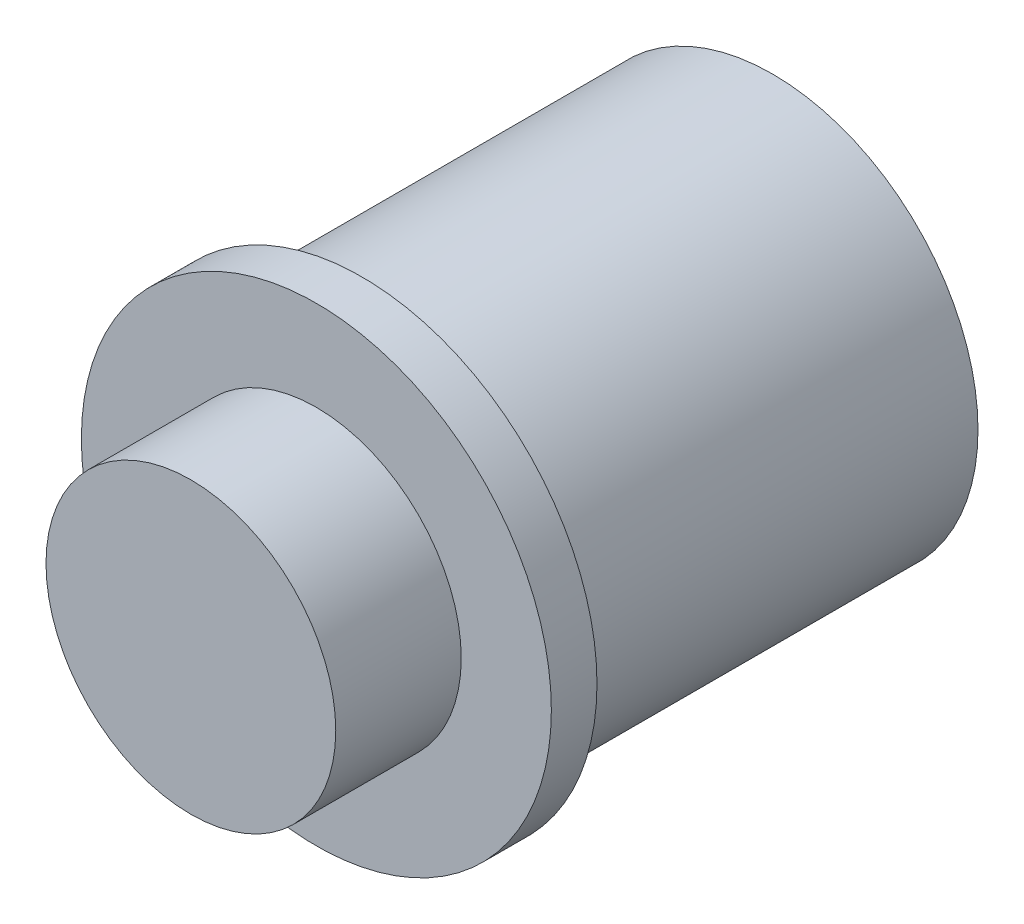
ISO-10303-21;
HEADER;
FILE_DESCRIPTION(('STEP AP214'),'2;1');
FILE_NAME('part.step','',(''),(''),'','','');
FILE_SCHEMA(('AUTOMOTIVE_DESIGN { 1 0 10303 214 1 1 1 1 }'));
ENDSEC;
DATA;
#1=APPLICATION_CONTEXT('core data for automotive mechanical design processes');
#2=APPLICATION_PROTOCOL_DEFINITION('international standard','automotive_design',2000,#1);
#3=PRODUCT_CONTEXT('',#1,'mechanical');
#4=PRODUCT('Part','Part','',(#3));
#5=PRODUCT_RELATED_PRODUCT_CATEGORY('part','',(#4));
#6=PRODUCT_DEFINITION_FORMATION('','',#4);
#7=PRODUCT_DEFINITION_CONTEXT('part definition',#1,'design');
#8=PRODUCT_DEFINITION('design','',#6,#7);
#9=PRODUCT_DEFINITION_SHAPE('','',#8);
#10=(LENGTH_UNIT() NAMED_UNIT(*) SI_UNIT(.MILLI.,.METRE.));
#11=(NAMED_UNIT(*) PLANE_ANGLE_UNIT() SI_UNIT($,.RADIAN.));
#12=(NAMED_UNIT(*) SI_UNIT($,.STERADIAN.) SOLID_ANGLE_UNIT());
#13=UNCERTAINTY_MEASURE_WITH_UNIT(LENGTH_MEASURE(1.E-05),#10,'distance_accuracy_value','');
#14=(GEOMETRIC_REPRESENTATION_CONTEXT(3) GLOBAL_UNCERTAINTY_ASSIGNED_CONTEXT((#13)) GLOBAL_UNIT_ASSIGNED_CONTEXT((#10,
#11,#12)) REPRESENTATION_CONTEXT('',''));
#15=CARTESIAN_POINT('',(0.,0.,0.));
#16=DIRECTION('',(0.,0.,1.));
#17=DIRECTION('',(1.,0.,0.));
#18=AXIS2_PLACEMENT_3D('',#15,#16,#17);
#19=CARTESIAN_POINT('',(0.,0.,18.));
#20=DIRECTION('',(0.,0.,-1.));
#21=DIRECTION('',(-1.,0.,0.));
#22=AXIS2_PLACEMENT_3D('',#19,#20,#21);
#23=CYLINDRICAL_SURFACE('',#22,9.);
#24=CARTESIAN_POINT('',(0.,0.,18.));
#25=DIRECTION('',(0.,0.,1.));
#26=DIRECTION('',(1.,0.,0.));
#27=AXIS2_PLACEMENT_3D('',#24,#25,#26);
#28=CIRCLE('',#27,9.);
#29=CARTESIAN_POINT('',(9.,0.,18.));
#30=VERTEX_POINT('',#29);
#31=EDGE_CURVE('E45',#30,#30,#28,.T.);
#32=ORIENTED_EDGE('',*,*,#31,.F.);
#33=EDGE_LOOP('',(#32));
#34=FACE_BOUND('',#33,.T.);
#35=CARTESIAN_POINT('',(0.,0.,0.));
#36=DIRECTION('',(0.,0.,1.));
#37=DIRECTION('',(1.,0.,0.));
#38=AXIS2_PLACEMENT_3D('',#35,#36,#37);
#39=CIRCLE('',#38,9.);
#40=CARTESIAN_POINT('',(9.,0.,0.));
#41=VERTEX_POINT('',#40);
#42=EDGE_CURVE('E40',#41,#41,#39,.T.);
#43=ORIENTED_EDGE('',*,*,#42,.T.);
#44=EDGE_LOOP('',(#43));
#45=FACE_BOUND('',#44,.T.);
#46=ADVANCED_FACE('F37',(#34,#45),#23,.T.);
#47=CARTESIAN_POINT('',(0.,0.,0.));
#48=DIRECTION('',(0.,0.,1.));
#49=DIRECTION('',(1.,0.,0.));
#50=AXIS2_PLACEMENT_3D('',#47,#48,#49);
#51=PLANE('',#50);
#52=ORIENTED_EDGE('',*,*,#42,.F.);
#53=EDGE_LOOP('',(#52));
#54=FACE_BOUND('',#53,.T.);
#55=ADVANCED_FACE('F83',(#54),#51,.F.);
#56=CARTESIAN_POINT('',(0.,0.,20.));
#57=DIRECTION('',(0.,0.,-1.));
#58=DIRECTION('',(-1.,0.,0.));
#59=AXIS2_PLACEMENT_3D('',#56,#57,#58);
#60=CYLINDRICAL_SURFACE('',#59,10.3);
#61=CARTESIAN_POINT('',(0.,0.,20.));
#62=DIRECTION('',(0.,0.,1.));
#63=DIRECTION('',(1.,0.,0.));
#64=AXIS2_PLACEMENT_3D('',#61,#62,#63);
#65=CIRCLE('',#64,10.3);
#66=CARTESIAN_POINT('',(10.3,0.,20.));
#67=VERTEX_POINT('',#66);
#68=EDGE_CURVE('E54',#67,#67,#65,.T.);
#69=ORIENTED_EDGE('',*,*,#68,.F.);
#70=EDGE_LOOP('',(#69));
#71=FACE_BOUND('',#70,.T.);
#72=CARTESIAN_POINT('',(0.,0.,18.));
#73=DIRECTION('',(0.,0.,1.));
#74=DIRECTION('',(1.,0.,0.));
#75=AXIS2_PLACEMENT_3D('',#72,#73,#74);
#76=CIRCLE('',#75,10.3);
#77=CARTESIAN_POINT('',(10.3,0.,18.));
#78=VERTEX_POINT('',#77);
#79=EDGE_CURVE('E58',#78,#78,#76,.T.);
#80=ORIENTED_EDGE('',*,*,#79,.T.);
#81=EDGE_LOOP('',(#80));
#82=FACE_BOUND('',#81,.T.);
#83=ADVANCED_FACE('F88',(#71,#82),#60,.T.);
#84=CARTESIAN_POINT('',(0.,0.,20.));
#85=DIRECTION('',(0.,0.,1.));
#86=DIRECTION('',(1.,0.,0.));
#87=AXIS2_PLACEMENT_3D('',#84,#85,#86);
#88=PLANE('',#87);
#89=CARTESIAN_POINT('',(0.,0.,20.));
#90=DIRECTION('',(0.,0.,1.));
#91=DIRECTION('',(1.,0.,0.));
#92=AXIS2_PLACEMENT_3D('',#89,#90,#91);
#93=CIRCLE('',#92,6.35);
#94=CARTESIAN_POINT('',(6.35,0.,20.));
#95=VERTEX_POINT('',#94);
#96=EDGE_CURVE('E10',#95,#95,#93,.T.);
#97=ORIENTED_EDGE('',*,*,#96,.F.);
#98=EDGE_LOOP('',(#97));
#99=FACE_BOUND('',#98,.T.);
#100=ORIENTED_EDGE('',*,*,#68,.T.);
#101=EDGE_LOOP('',(#100));
#102=FACE_BOUND('',#101,.T.);
#103=ADVANCED_FACE('F78',(#99,#102),#88,.T.);
#104=CARTESIAN_POINT('',(0.,0.,18.));
#105=DIRECTION('',(0.,0.,1.));
#106=DIRECTION('',(1.,0.,0.));
#107=AXIS2_PLACEMENT_3D('',#104,#105,#106);
#108=PLANE('',#107);
#109=ORIENTED_EDGE('',*,*,#31,.T.);
#110=EDGE_LOOP('',(#109));
#111=FACE_BOUND('',#110,.T.);
#112=ORIENTED_EDGE('',*,*,#79,.F.);
#113=EDGE_LOOP('',(#112));
#114=FACE_BOUND('',#113,.T.);
#115=ADVANCED_FACE('F71',(#111,#114),#108,.F.);
#116=CARTESIAN_POINT('',(0.,0.,25.5));
#117=DIRECTION('',(0.,0.,-1.));
#118=DIRECTION('',(-1.,0.,0.));
#119=AXIS2_PLACEMENT_3D('',#116,#117,#118);
#120=CYLINDRICAL_SURFACE('',#119,6.35);
#121=CARTESIAN_POINT('',(0.,0.,25.5));
#122=DIRECTION('',(0.,0.,1.));
#123=DIRECTION('',(1.,0.,0.));
#124=AXIS2_PLACEMENT_3D('',#121,#122,#123);
#125=CIRCLE('',#124,6.35);
#126=CARTESIAN_POINT('',(6.35,0.,25.5));
#127=VERTEX_POINT('',#126);
#128=EDGE_CURVE('E53',#127,#127,#125,.T.);
#129=ORIENTED_EDGE('',*,*,#128,.F.);
#130=EDGE_LOOP('',(#129));
#131=FACE_BOUND('',#130,.T.);
#132=ORIENTED_EDGE('',*,*,#96,.T.);
#133=EDGE_LOOP('',(#132));
#134=FACE_BOUND('',#133,.T.);
#135=ADVANCED_FACE('F69',(#131,#134),#120,.T.);
#136=CARTESIAN_POINT('',(0.,0.,25.5));
#137=DIRECTION('',(0.,0.,1.));
#138=DIRECTION('',(1.,0.,0.));
#139=AXIS2_PLACEMENT_3D('',#136,#137,#138);
#140=PLANE('',#139);
#141=ORIENTED_EDGE('',*,*,#128,.T.);
#142=EDGE_LOOP('',(#141));
#143=FACE_BOUND('',#142,.T.);
#144=ADVANCED_FACE('F67',(#143),#140,.T.);
#145=CLOSED_SHELL('',(#46,#55,#83,#103,#115,#135,#144));
#146=MANIFOLD_SOLID_BREP('B2',#145);
#147=ADVANCED_BREP_SHAPE_REPRESENTATION('',(#18,#146),#14);
#148=SHAPE_DEFINITION_REPRESENTATION(#9,#147);
ENDSEC;
END-ISO-10303-21;
